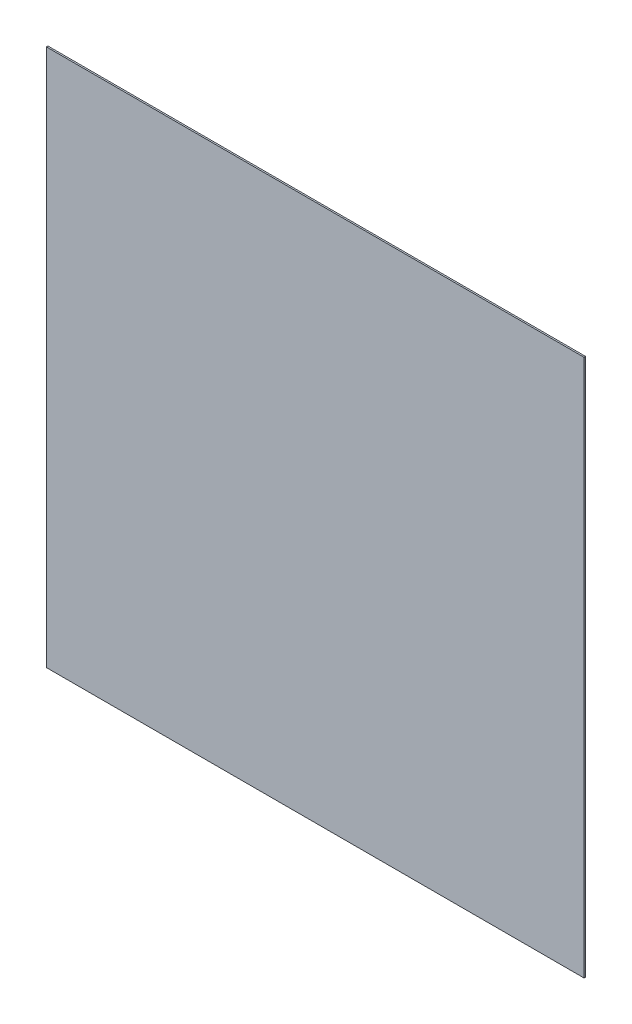
ISO-10303-21;
HEADER;
FILE_DESCRIPTION(('STEP AP214'),'2;1');
FILE_NAME('part.step','',(''),(''),'','','');
FILE_SCHEMA(('AUTOMOTIVE_DESIGN { 1 0 10303 214 1 1 1 1 }'));
ENDSEC;
DATA;
#1=APPLICATION_CONTEXT('core data for automotive mechanical design processes');
#2=APPLICATION_PROTOCOL_DEFINITION('international standard','automotive_design',2000,#1);
#3=PRODUCT_CONTEXT('',#1,'mechanical');
#4=PRODUCT('Part','Part','',(#3));
#5=PRODUCT_RELATED_PRODUCT_CATEGORY('part','',(#4));
#6=PRODUCT_DEFINITION_FORMATION('','',#4);
#7=PRODUCT_DEFINITION_CONTEXT('part definition',#1,'design');
#8=PRODUCT_DEFINITION('design','',#6,#7);
#9=PRODUCT_DEFINITION_SHAPE('','',#8);
#10=(LENGTH_UNIT() NAMED_UNIT(*) SI_UNIT(.MILLI.,.METRE.));
#11=(NAMED_UNIT(*) PLANE_ANGLE_UNIT() SI_UNIT($,.RADIAN.));
#12=(NAMED_UNIT(*) SI_UNIT($,.STERADIAN.) SOLID_ANGLE_UNIT());
#13=UNCERTAINTY_MEASURE_WITH_UNIT(LENGTH_MEASURE(1.E-05),#10,'distance_accuracy_value','');
#14=(GEOMETRIC_REPRESENTATION_CONTEXT(3) GLOBAL_UNCERTAINTY_ASSIGNED_CONTEXT((#13)) GLOBAL_UNIT_ASSIGNED_CONTEXT((#10,
#11,#12)) REPRESENTATION_CONTEXT('',''));
#15=CARTESIAN_POINT('',(0.,0.,0.));
#16=DIRECTION('',(0.,0.,1.));
#17=DIRECTION('',(1.,0.,0.));
#18=AXIS2_PLACEMENT_3D('',#15,#16,#17);
#19=CARTESIAN_POINT('',(13.1864586666667,-12.1992253333333,0.86487));
#20=DIRECTION('',(1.,0.,0.));
#21=DIRECTION('',(0.,0.,1.));
#22=AXIS2_PLACEMENT_3D('',#19,#20,#21);
#23=PLANE('',#22);
#24=DIRECTION('',(0.,1.,0.));
#25=VECTOR('',#24,1.);
#26=CARTESIAN_POINT('',(13.1864586666667,-9.199224,0.882015));
#27=LINE('',#26,#25);
#28=CARTESIAN_POINT('',(13.1864586666667,-12.1992253333333,0.882015));
#29=VERTEX_POINT('',#28);
#30=CARTESIAN_POINT('',(13.1864586666667,-6.19922266666667,0.882015));
#31=VERTEX_POINT('',#30);
#32=EDGE_CURVE('E123',#29,#31,#27,.T.);
#33=ORIENTED_EDGE('',*,*,#32,.T.);
#34=DIRECTION('',(0.,0.,-1.));
#35=VECTOR('',#34,1.);
#36=CARTESIAN_POINT('',(13.1864586666667,-6.19922266666667,0.8734425));
#37=LINE('',#36,#35);
#38=CARTESIAN_POINT('',(13.1864586666667,-6.19922266666667,0.86487));
#39=VERTEX_POINT('',#38);
#40=EDGE_CURVE('E20',#31,#39,#37,.T.);
#41=ORIENTED_EDGE('',*,*,#40,.T.);
#42=DIRECTION('',(0.,1.,0.));
#43=VECTOR('',#42,1.);
#44=CARTESIAN_POINT('',(13.1864586666667,-12.1992253333333,0.86487));
#45=LINE('',#44,#43);
#46=CARTESIAN_POINT('',(13.1864586666667,-12.1992253333333,0.86487));
#47=VERTEX_POINT('',#46);
#48=EDGE_CURVE('E88',#47,#39,#45,.T.);
#49=ORIENTED_EDGE('',*,*,#48,.F.);
#50=DIRECTION('',(0.,0.,-1.));
#51=VECTOR('',#50,1.);
#52=CARTESIAN_POINT('',(13.1864586666667,-12.1992253333333,0.8734425));
#53=LINE('',#52,#51);
#54=EDGE_CURVE('E11',#29,#47,#53,.T.);
#55=ORIENTED_EDGE('',*,*,#54,.F.);
#56=EDGE_LOOP('',(#33,#41,#49,#55));
#57=FACE_BOUND('',#56,.T.);
#58=ADVANCED_FACE('F16',(#57),#23,.F.);
#59=CARTESIAN_POINT('',(19.1864613333334,-12.1992253333333,0.86487));
#60=DIRECTION('',(0.,1.,0.));
#61=DIRECTION('',(0.,0.,-1.));
#62=AXIS2_PLACEMENT_3D('',#59,#60,#61);
#63=PLANE('',#62);
#64=DIRECTION('',(-1.,0.,0.));
#65=VECTOR('',#64,1.);
#66=CARTESIAN_POINT('',(16.18646,-12.1992253333333,0.882015));
#67=LINE('',#66,#65);
#68=CARTESIAN_POINT('',(19.1864613333334,-12.1992253333333,0.882015));
#69=VERTEX_POINT('',#68);
#70=EDGE_CURVE('E82',#69,#29,#67,.T.);
#71=ORIENTED_EDGE('',*,*,#70,.T.);
#72=ORIENTED_EDGE('',*,*,#54,.T.);
#73=DIRECTION('',(-1.,0.,0.));
#74=VECTOR('',#73,1.);
#75=CARTESIAN_POINT('',(19.1864613333334,-12.1992253333333,0.86487));
#76=LINE('',#75,#74);
#77=CARTESIAN_POINT('',(19.1864613333334,-12.1992253333333,0.86487));
#78=VERTEX_POINT('',#77);
#79=EDGE_CURVE('E79',#78,#47,#76,.T.);
#80=ORIENTED_EDGE('',*,*,#79,.F.);
#81=DIRECTION('',(0.,0.,-1.));
#82=VECTOR('',#81,1.);
#83=CARTESIAN_POINT('',(19.1864613333334,-12.1992253333333,0.8734425));
#84=LINE('',#83,#82);
#85=EDGE_CURVE('E27',#69,#78,#84,.T.);
#86=ORIENTED_EDGE('',*,*,#85,.F.);
#87=EDGE_LOOP('',(#71,#72,#80,#86));
#88=FACE_BOUND('',#87,.T.);
#89=ADVANCED_FACE('F78',(#88),#63,.F.);
#90=CARTESIAN_POINT('',(19.1864613333334,-6.19922266666667,0.86487));
#91=DIRECTION('',(-1.,0.,0.));
#92=DIRECTION('',(0.,0.,1.));
#93=AXIS2_PLACEMENT_3D('',#90,#91,#92);
#94=PLANE('',#93);
#95=DIRECTION('',(0.,-1.,0.));
#96=VECTOR('',#95,1.);
#97=CARTESIAN_POINT('',(19.1864613333334,-9.199224,0.882015));
#98=LINE('',#97,#96);
#99=CARTESIAN_POINT('',(19.1864613333334,-6.19922266666667,0.882015));
#100=VERTEX_POINT('',#99);
#101=EDGE_CURVE('E102',#100,#69,#98,.T.);
#102=ORIENTED_EDGE('',*,*,#101,.T.);
#103=ORIENTED_EDGE('',*,*,#85,.T.);
#104=DIRECTION('',(0.,-1.,0.));
#105=VECTOR('',#104,1.);
#106=CARTESIAN_POINT('',(19.1864613333334,-6.19922266666667,0.86487));
#107=LINE('',#106,#105);
#108=CARTESIAN_POINT('',(19.1864613333334,-6.19922266666667,0.86487));
#109=VERTEX_POINT('',#108);
#110=EDGE_CURVE('E89',#109,#78,#107,.T.);
#111=ORIENTED_EDGE('',*,*,#110,.F.);
#112=DIRECTION('',(0.,0.,-1.));
#113=VECTOR('',#112,1.);
#114=CARTESIAN_POINT('',(19.1864613333334,-6.19922266666667,0.8734425));
#115=LINE('',#114,#113);
#116=EDGE_CURVE('E91',#100,#109,#115,.T.);
#117=ORIENTED_EDGE('',*,*,#116,.F.);
#118=EDGE_LOOP('',(#102,#103,#111,#117));
#119=FACE_BOUND('',#118,.T.);
#120=ADVANCED_FACE('F131',(#119),#94,.F.);
#121=CARTESIAN_POINT('',(13.1864586666667,-6.19922266666667,0.86487));
#122=DIRECTION('',(0.,-1.,0.));
#123=DIRECTION('',(0.,0.,-1.));
#124=AXIS2_PLACEMENT_3D('',#121,#122,#123);
#125=PLANE('',#124);
#126=DIRECTION('',(1.,0.,0.));
#127=VECTOR('',#126,1.);
#128=CARTESIAN_POINT('',(16.18646,-6.19922266666667,0.882015));
#129=LINE('',#128,#127);
#130=EDGE_CURVE('E94',#31,#100,#129,.T.);
#131=ORIENTED_EDGE('',*,*,#130,.T.);
#132=ORIENTED_EDGE('',*,*,#116,.T.);
#133=DIRECTION('',(1.,0.,0.));
#134=VECTOR('',#133,1.);
#135=CARTESIAN_POINT('',(13.1864586666667,-6.19922266666667,0.86487));
#136=LINE('',#135,#134);
#137=EDGE_CURVE('E93',#39,#109,#136,.T.);
#138=ORIENTED_EDGE('',*,*,#137,.F.);
#139=ORIENTED_EDGE('',*,*,#40,.F.);
#140=EDGE_LOOP('',(#131,#132,#138,#139));
#141=FACE_BOUND('',#140,.T.);
#142=ADVANCED_FACE('F129',(#141),#125,.F.);
#143=CARTESIAN_POINT('',(16.18646,-9.199224,0.86487));
#144=DIRECTION('',(0.,0.,-1.));
#145=DIRECTION('',(-1.,0.,0.));
#146=AXIS2_PLACEMENT_3D('',#143,#144,#145);
#147=PLANE('',#146);
#148=ORIENTED_EDGE('',*,*,#48,.T.);
#149=ORIENTED_EDGE('',*,*,#137,.T.);
#150=ORIENTED_EDGE('',*,*,#110,.T.);
#151=ORIENTED_EDGE('',*,*,#79,.T.);
#152=EDGE_LOOP('',(#148,#149,#150,#151));
#153=FACE_BOUND('',#152,.T.);
#154=ADVANCED_FACE('F86',(#153),#147,.T.);
#155=CARTESIAN_POINT('',(16.18646,-9.199224,0.882015));
#156=DIRECTION('',(0.,0.,1.));
#157=DIRECTION('',(0.,-1.,0.));
#158=AXIS2_PLACEMENT_3D('',#155,#156,#157);
#159=PLANE('',#158);
#160=ORIENTED_EDGE('',*,*,#32,.F.);
#161=ORIENTED_EDGE('',*,*,#70,.F.);
#162=ORIENTED_EDGE('',*,*,#101,.F.);
#163=ORIENTED_EDGE('',*,*,#130,.F.);
#164=EDGE_LOOP('',(#160,#161,#162,#163));
#165=FACE_BOUND('',#164,.T.);
#166=ADVANCED_FACE('F18',(#165),#159,.T.);
#167=CLOSED_SHELL('',(#58,#89,#120,#142,#154,#166));
#168=MANIFOLD_SOLID_BREP('B1',#167);
#169=ADVANCED_BREP_SHAPE_REPRESENTATION('',(#18,#168),#14);
#170=SHAPE_DEFINITION_REPRESENTATION(#9,#169);
ENDSEC;
END-ISO-10303-21;
